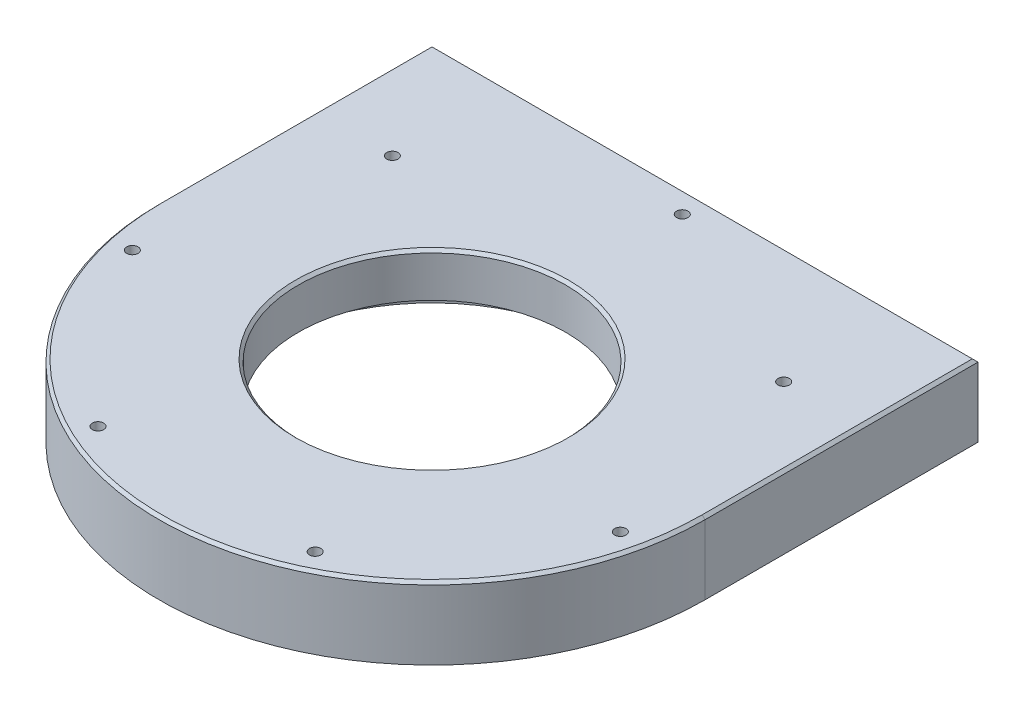
ISO-10303-21;
HEADER;
FILE_DESCRIPTION(('STEP AP214'),'2;1');
FILE_NAME('part.step','',(''),(''),'','','');
FILE_SCHEMA(('AUTOMOTIVE_DESIGN { 1 0 10303 214 1 1 1 1 }'));
ENDSEC;
DATA;
#1=APPLICATION_CONTEXT('core data for automotive mechanical design processes');
#2=APPLICATION_PROTOCOL_DEFINITION('international standard','automotive_design',2000,#1);
#3=PRODUCT_CONTEXT('',#1,'mechanical');
#4=PRODUCT('Part','Part','',(#3));
#5=PRODUCT_RELATED_PRODUCT_CATEGORY('part','',(#4));
#6=PRODUCT_DEFINITION_FORMATION('','',#4);
#7=PRODUCT_DEFINITION_CONTEXT('part definition',#1,'design');
#8=PRODUCT_DEFINITION('design','',#6,#7);
#9=PRODUCT_DEFINITION_SHAPE('','',#8);
#10=(LENGTH_UNIT() NAMED_UNIT(*) SI_UNIT(.MILLI.,.METRE.));
#11=(NAMED_UNIT(*) PLANE_ANGLE_UNIT() SI_UNIT($,.RADIAN.));
#12=(NAMED_UNIT(*) SI_UNIT($,.STERADIAN.) SOLID_ANGLE_UNIT());
#13=UNCERTAINTY_MEASURE_WITH_UNIT(LENGTH_MEASURE(1.E-05),#10,'distance_accuracy_value','');
#14=(GEOMETRIC_REPRESENTATION_CONTEXT(3) GLOBAL_UNCERTAINTY_ASSIGNED_CONTEXT((#13)) GLOBAL_UNIT_ASSIGNED_CONTEXT((#10,
#11,#12)) REPRESENTATION_CONTEXT('',''));
#15=CARTESIAN_POINT('',(0.,0.,0.));
#16=DIRECTION('',(0.,0.,1.));
#17=DIRECTION('',(1.,0.,0.));
#18=AXIS2_PLACEMENT_3D('',#15,#16,#17);
#19=CARTESIAN_POINT('',(48.,12.7,-48.));
#20=DIRECTION('',(-1.,0.,0.));
#21=DIRECTION('',(0.,0.,1.));
#22=AXIS2_PLACEMENT_3D('',#19,#20,#21);
#23=PLANE('',#22);
#24=DIRECTION('',(0.,-1.,0.));
#25=VECTOR('',#24,1.);
#26=CARTESIAN_POINT('',(48.,12.7,-48.));
#27=LINE('',#26,#25);
#28=CARTESIAN_POINT('',(48.,12.2,-48.));
#29=VERTEX_POINT('',#28);
#30=CARTESIAN_POINT('',(48.,0.,-48.));
#31=VERTEX_POINT('',#30);
#32=EDGE_CURVE('E124',#29,#31,#27,.T.);
#33=ORIENTED_EDGE('',*,*,#32,.F.);
#34=DIRECTION('',(0.,0.,1.));
#35=VECTOR('',#34,1.);
#36=CARTESIAN_POINT('',(48.,12.2,-48.));
#37=LINE('',#36,#35);
#38=CARTESIAN_POINT('',(48.,12.2,0.));
#39=VERTEX_POINT('',#38);
#40=EDGE_CURVE('E148',#29,#39,#37,.T.);
#41=ORIENTED_EDGE('',*,*,#40,.T.);
#42=DIRECTION('',(0.,-1.,0.));
#43=VECTOR('',#42,1.);
#44=CARTESIAN_POINT('',(48.,12.7,0.));
#45=LINE('',#44,#43);
#46=CARTESIAN_POINT('',(48.,0.,0.));
#47=VERTEX_POINT('',#46);
#48=EDGE_CURVE('E126',#39,#47,#45,.T.);
#49=ORIENTED_EDGE('',*,*,#48,.T.);
#50=DIRECTION('',(0.,0.,-1.));
#51=VECTOR('',#50,1.);
#52=CARTESIAN_POINT('',(48.,0.,-48.));
#53=LINE('',#52,#51);
#54=EDGE_CURVE('E113',#47,#31,#53,.T.);
#55=ORIENTED_EDGE('',*,*,#54,.T.);
#56=EDGE_LOOP('',(#33,#41,#49,#55));
#57=FACE_BOUND('',#56,.T.);
#58=ADVANCED_FACE('F41',(#57),#23,.F.);
#59=CARTESIAN_POINT('',(-48.,12.7,-48.));
#60=DIRECTION('',(0.,0.,1.));
#61=DIRECTION('',(1.,0.,0.));
#62=AXIS2_PLACEMENT_3D('',#59,#60,#61);
#63=PLANE('',#62);
#64=DIRECTION('',(0.,-1.,0.));
#65=VECTOR('',#64,1.);
#66=CARTESIAN_POINT('',(-48.,12.7,-48.));
#67=LINE('',#66,#65);
#68=CARTESIAN_POINT('',(-48.,12.2,-48.));
#69=VERTEX_POINT('',#68);
#70=CARTESIAN_POINT('',(-48.,0.,-48.));
#71=VERTEX_POINT('',#70);
#72=EDGE_CURVE('E100',#69,#71,#67,.T.);
#73=ORIENTED_EDGE('',*,*,#72,.F.);
#74=DIRECTION('',(1.,0.,0.));
#75=VECTOR('',#74,1.);
#76=CARTESIAN_POINT('',(-48.,12.2,-48.));
#77=LINE('',#76,#75);
#78=EDGE_CURVE('E11',#69,#29,#77,.T.);
#79=ORIENTED_EDGE('',*,*,#78,.T.);
#80=ORIENTED_EDGE('',*,*,#32,.T.);
#81=DIRECTION('',(-1.,0.,0.));
#82=VECTOR('',#81,1.);
#83=CARTESIAN_POINT('',(-48.,0.,-48.));
#84=LINE('',#83,#82);
#85=EDGE_CURVE('E108',#31,#71,#84,.T.);
#86=ORIENTED_EDGE('',*,*,#85,.T.);
#87=EDGE_LOOP('',(#73,#79,#80,#86));
#88=FACE_BOUND('',#87,.T.);
#89=ADVANCED_FACE('F229',(#88),#63,.F.);
#90=CARTESIAN_POINT('',(-48.,12.7,0.));
#91=DIRECTION('',(1.,0.,0.));
#92=DIRECTION('',(0.,0.,-1.));
#93=AXIS2_PLACEMENT_3D('',#90,#91,#92);
#94=PLANE('',#93);
#95=DIRECTION('',(0.,-1.,0.));
#96=VECTOR('',#95,1.);
#97=CARTESIAN_POINT('',(-48.,12.7,0.));
#98=LINE('',#97,#96);
#99=CARTESIAN_POINT('',(-48.,12.2,0.));
#100=VERTEX_POINT('',#99);
#101=CARTESIAN_POINT('',(-48.,0.,0.));
#102=VERTEX_POINT('',#101);
#103=EDGE_CURVE('E94',#100,#102,#98,.T.);
#104=ORIENTED_EDGE('',*,*,#103,.F.);
#105=DIRECTION('',(0.,0.,-1.));
#106=VECTOR('',#105,1.);
#107=CARTESIAN_POINT('',(-48.,12.2,0.));
#108=LINE('',#107,#106);
#109=EDGE_CURVE('E51',#100,#69,#108,.T.);
#110=ORIENTED_EDGE('',*,*,#109,.T.);
#111=ORIENTED_EDGE('',*,*,#72,.T.);
#112=DIRECTION('',(0.,0.,1.));
#113=VECTOR('',#112,1.);
#114=CARTESIAN_POINT('',(-48.,0.,0.));
#115=LINE('',#114,#113);
#116=EDGE_CURVE('E101',#71,#102,#115,.T.);
#117=ORIENTED_EDGE('',*,*,#116,.T.);
#118=EDGE_LOOP('',(#104,#110,#111,#117));
#119=FACE_BOUND('',#118,.T.);
#120=ADVANCED_FACE('F104',(#119),#94,.F.);
#121=CARTESIAN_POINT('',(0.,12.7,0.));
#122=DIRECTION('',(0.,-1.,0.));
#123=DIRECTION('',(0.,0.,-1.));
#124=AXIS2_PLACEMENT_3D('',#121,#122,#123);
#125=PLANE('',#124);
#126=CARTESIAN_POINT('',(0.,12.7,0.));
#127=DIRECTION('',(0.,-1.,0.));
#128=DIRECTION('',(0.,0.,-1.));
#129=AXIS2_PLACEMENT_3D('',#126,#127,#128);
#130=CIRCLE('',#129,24.);
#131=CARTESIAN_POINT('',(0.,12.7,-24.));
#132=VERTEX_POINT('',#131);
#133=EDGE_CURVE('E145',#132,#132,#130,.T.);
#134=ORIENTED_EDGE('',*,*,#133,.T.);
#135=EDGE_LOOP('',(#134));
#136=FACE_BOUND('',#135,.T.);
#137=CARTESIAN_POINT('',(0.,12.7,0.));
#138=DIRECTION('',(0.,-1.,0.));
#139=DIRECTION('',(0.,0.,-1.));
#140=AXIS2_PLACEMENT_3D('',#137,#138,#139);
#141=CIRCLE('',#140,47.5);
#142=CARTESIAN_POINT('',(-47.5,12.7,0.));
#143=VERTEX_POINT('',#142);
#144=CARTESIAN_POINT('',(47.5,12.7,0.));
#145=VERTEX_POINT('',#144);
#146=EDGE_CURVE('E140',#143,#145,#141,.F.);
#147=ORIENTED_EDGE('',*,*,#146,.T.);
#148=DIRECTION('',(0.,0.,-1.));
#149=VECTOR('',#148,1.);
#150=CARTESIAN_POINT('',(47.5,12.7,0.));
#151=LINE('',#150,#149);
#152=CARTESIAN_POINT('',(47.5,12.7,-47.5));
#153=VERTEX_POINT('',#152);
#154=EDGE_CURVE('E142',#145,#153,#151,.T.);
#155=ORIENTED_EDGE('',*,*,#154,.T.);
#156=DIRECTION('',(-1.,0.,0.));
#157=VECTOR('',#156,1.);
#158=CARTESIAN_POINT('',(0.,12.7,-47.5));
#159=LINE('',#158,#157);
#160=CARTESIAN_POINT('',(-47.5,12.7,-47.5));
#161=VERTEX_POINT('',#160);
#162=EDGE_CURVE('E136',#153,#161,#159,.T.);
#163=ORIENTED_EDGE('',*,*,#162,.T.);
#164=DIRECTION('',(0.,0.,1.));
#165=VECTOR('',#164,1.);
#166=CARTESIAN_POINT('',(-47.5,12.7,0.));
#167=LINE('',#166,#165);
#168=EDGE_CURVE('E138',#161,#143,#167,.T.);
#169=ORIENTED_EDGE('',*,*,#168,.T.);
#170=EDGE_LOOP('',(#147,#155,#163,#169));
#171=FACE_BOUND('',#170,.T.);
#172=CARTESIAN_POINT('',(34.4005852285933,12.7,-27.4335512817843));
#173=DIRECTION('',(0.,1.,0.));
#174=DIRECTION('',(0.,0.,1.));
#175=AXIS2_PLACEMENT_3D('',#172,#173,#174);
#176=CIRCLE('',#175,0.999999999999998);
#177=CARTESIAN_POINT('',(34.4005852285933,12.7,-26.4335512817843));
#178=VERTEX_POINT('',#177);
#179=EDGE_CURVE('E174',#178,#178,#176,.T.);
#180=ORIENTED_EDGE('',*,*,#179,.F.);
#181=EDGE_LOOP('',(#180));
#182=FACE_BOUND('',#181,.T.);
#183=CARTESIAN_POINT('',(0.,12.7,-44.));
#184=DIRECTION('',(0.,1.,0.));
#185=DIRECTION('',(0.,0.,1.));
#186=AXIS2_PLACEMENT_3D('',#183,#184,#185);
#187=CIRCLE('',#186,1.);
#188=CARTESIAN_POINT('',(0.,12.7,-43.));
#189=VERTEX_POINT('',#188);
#190=EDGE_CURVE('E184',#189,#189,#187,.T.);
#191=ORIENTED_EDGE('',*,*,#190,.F.);
#192=EDGE_LOOP('',(#191));
#193=FACE_BOUND('',#192,.T.);
#194=CARTESIAN_POINT('',(-34.4005852285933,12.7,-27.4335512817843));
#195=DIRECTION('',(0.,1.,0.));
#196=DIRECTION('',(0.,0.,1.));
#197=AXIS2_PLACEMENT_3D('',#194,#195,#196);
#198=CIRCLE('',#197,0.999999999999998);
#199=CARTESIAN_POINT('',(-34.4005852285933,12.7,-26.4335512817843));
#200=VERTEX_POINT('',#199);
#201=EDGE_CURVE('E132',#200,#200,#198,.T.);
#202=ORIENTED_EDGE('',*,*,#201,.F.);
#203=EDGE_LOOP('',(#202));
#204=FACE_BOUND('',#203,.T.);
#205=CARTESIAN_POINT('',(-19.0908845211726,12.7,39.6426301877064));
#206=DIRECTION('',(0.,1.,0.));
#207=DIRECTION('',(0.,0.,1.));
#208=AXIS2_PLACEMENT_3D('',#205,#206,#207);
#209=CIRCLE('',#208,1.);
#210=CARTESIAN_POINT('',(-19.0908845211726,12.7,40.6426301877064));
#211=VERTEX_POINT('',#210);
#212=EDGE_CURVE('E198',#211,#211,#209,.T.);
#213=ORIENTED_EDGE('',*,*,#212,.F.);
#214=EDGE_LOOP('',(#213));
#215=FACE_BOUND('',#214,.T.);
#216=CARTESIAN_POINT('',(42.8968281360002,12.7,9.79092109407783));
#217=DIRECTION('',(0.,1.,0.));
#218=DIRECTION('',(0.,0.,1.));
#219=AXIS2_PLACEMENT_3D('',#216,#217,#218);
#220=CIRCLE('',#219,0.999999999999998);
#221=CARTESIAN_POINT('',(42.8968281360002,12.7,10.7909210940778));
#222=VERTEX_POINT('',#221);
#223=EDGE_CURVE('E114',#222,#222,#220,.T.);
#224=ORIENTED_EDGE('',*,*,#223,.F.);
#225=EDGE_LOOP('',(#224));
#226=FACE_BOUND('',#225,.T.);
#227=CARTESIAN_POINT('',(19.0908845211726,12.7,39.6426301877064));
#228=DIRECTION('',(0.,1.,0.));
#229=DIRECTION('',(0.,0.,1.));
#230=AXIS2_PLACEMENT_3D('',#227,#228,#229);
#231=CIRCLE('',#230,1.);
#232=CARTESIAN_POINT('',(19.0908845211726,12.7,40.6426301877064));
#233=VERTEX_POINT('',#232);
#234=EDGE_CURVE('E204',#233,#233,#231,.T.);
#235=ORIENTED_EDGE('',*,*,#234,.F.);
#236=EDGE_LOOP('',(#235));
#237=FACE_BOUND('',#236,.T.);
#238=CARTESIAN_POINT('',(-42.8968281360002,12.7,9.79092109407784));
#239=DIRECTION('',(0.,1.,0.));
#240=DIRECTION('',(0.,0.,1.));
#241=AXIS2_PLACEMENT_3D('',#238,#239,#240);
#242=CIRCLE('',#241,0.999999999999998);
#243=CARTESIAN_POINT('',(-42.8968281360002,12.7,10.7909210940778));
#244=VERTEX_POINT('',#243);
#245=EDGE_CURVE('E192',#244,#244,#242,.T.);
#246=ORIENTED_EDGE('',*,*,#245,.F.);
#247=EDGE_LOOP('',(#246));
#248=FACE_BOUND('',#247,.T.);
#249=ADVANCED_FACE('F278',(#136,#171,#182,#193,#204,#215,#226,#237,#248),#125,.F.);
#250=CARTESIAN_POINT('',(0.,0.,0.));
#251=DIRECTION('',(0.,-1.,0.));
#252=DIRECTION('',(0.,0.,-1.));
#253=AXIS2_PLACEMENT_3D('',#250,#251,#252);
#254=PLANE('',#253);
#255=CARTESIAN_POINT('',(0.,0.,0.));
#256=DIRECTION('',(0.,1.,0.));
#257=DIRECTION('',(0.,0.,1.));
#258=AXIS2_PLACEMENT_3D('',#255,#256,#257);
#259=CIRCLE('',#258,30.);
#260=CARTESIAN_POINT('',(0.,0.,30.));
#261=VERTEX_POINT('',#260);
#262=EDGE_CURVE('E163',#261,#261,#259,.T.);
#263=ORIENTED_EDGE('',*,*,#262,.T.);
#264=EDGE_LOOP('',(#263));
#265=FACE_BOUND('',#264,.T.);
#266=CARTESIAN_POINT('',(34.4005852285933,0.,-27.4335512817843));
#267=DIRECTION('',(0.,1.,0.));
#268=DIRECTION('',(0.,0.,1.));
#269=AXIS2_PLACEMENT_3D('',#266,#267,#268);
#270=CIRCLE('',#269,0.999999999999998);
#271=CARTESIAN_POINT('',(34.4005852285933,0.,-26.4335512817843));
#272=VERTEX_POINT('',#271);
#273=EDGE_CURVE('E178',#272,#272,#270,.T.);
#274=ORIENTED_EDGE('',*,*,#273,.T.);
#275=EDGE_LOOP('',(#274));
#276=FACE_BOUND('',#275,.T.);
#277=CARTESIAN_POINT('',(0.,0.,-44.));
#278=DIRECTION('',(0.,1.,0.));
#279=DIRECTION('',(0.,0.,1.));
#280=AXIS2_PLACEMENT_3D('',#277,#278,#279);
#281=CIRCLE('',#280,1.);
#282=CARTESIAN_POINT('',(0.,0.,-43.));
#283=VERTEX_POINT('',#282);
#284=EDGE_CURVE('E181',#283,#283,#281,.T.);
#285=ORIENTED_EDGE('',*,*,#284,.T.);
#286=EDGE_LOOP('',(#285));
#287=FACE_BOUND('',#286,.T.);
#288=CARTESIAN_POINT('',(-34.4005852285933,0.,-27.4335512817843));
#289=DIRECTION('',(0.,1.,0.));
#290=DIRECTION('',(0.,0.,1.));
#291=AXIS2_PLACEMENT_3D('',#288,#289,#290);
#292=CIRCLE('',#291,0.999999999999998);
#293=CARTESIAN_POINT('',(-34.4005852285933,0.,-26.4335512817843));
#294=VERTEX_POINT('',#293);
#295=EDGE_CURVE('E187',#294,#294,#292,.T.);
#296=ORIENTED_EDGE('',*,*,#295,.T.);
#297=EDGE_LOOP('',(#296));
#298=FACE_BOUND('',#297,.T.);
#299=ORIENTED_EDGE('',*,*,#54,.F.);
#300=CARTESIAN_POINT('',(0.,0.,0.));
#301=DIRECTION('',(0.,1.,0.));
#302=DIRECTION('',(0.,0.,1.));
#303=AXIS2_PLACEMENT_3D('',#300,#301,#302);
#304=CIRCLE('',#303,48.);
#305=EDGE_CURVE('E98',#102,#47,#304,.T.);
#306=ORIENTED_EDGE('',*,*,#305,.F.);
#307=ORIENTED_EDGE('',*,*,#116,.F.);
#308=ORIENTED_EDGE('',*,*,#85,.F.);
#309=EDGE_LOOP('',(#299,#306,#307,#308));
#310=FACE_BOUND('',#309,.T.);
#311=CARTESIAN_POINT('',(-42.8968281360002,0.,9.79092109407784));
#312=DIRECTION('',(0.,1.,0.));
#313=DIRECTION('',(0.,0.,1.));
#314=AXIS2_PLACEMENT_3D('',#311,#312,#313);
#315=CIRCLE('',#314,0.999999999999998);
#316=CARTESIAN_POINT('',(-42.8968281360002,0.,10.7909210940778));
#317=VERTEX_POINT('',#316);
#318=EDGE_CURVE('E177',#317,#317,#315,.T.);
#319=ORIENTED_EDGE('',*,*,#318,.T.);
#320=EDGE_LOOP('',(#319));
#321=FACE_BOUND('',#320,.T.);
#322=CARTESIAN_POINT('',(-19.0908845211726,0.,39.6426301877064));
#323=DIRECTION('',(0.,1.,0.));
#324=DIRECTION('',(0.,0.,1.));
#325=AXIS2_PLACEMENT_3D('',#322,#323,#324);
#326=CIRCLE('',#325,1.);
#327=CARTESIAN_POINT('',(-19.0908845211726,0.,40.6426301877064));
#328=VERTEX_POINT('',#327);
#329=EDGE_CURVE('E195',#328,#328,#326,.T.);
#330=ORIENTED_EDGE('',*,*,#329,.T.);
#331=EDGE_LOOP('',(#330));
#332=FACE_BOUND('',#331,.T.);
#333=CARTESIAN_POINT('',(19.0908845211726,0.,39.6426301877064));
#334=DIRECTION('',(0.,1.,0.));
#335=DIRECTION('',(0.,0.,1.));
#336=AXIS2_PLACEMENT_3D('',#333,#334,#335);
#337=CIRCLE('',#336,1.);
#338=CARTESIAN_POINT('',(19.0908845211726,0.,40.6426301877064));
#339=VERTEX_POINT('',#338);
#340=EDGE_CURVE('E201',#339,#339,#337,.T.);
#341=ORIENTED_EDGE('',*,*,#340,.T.);
#342=EDGE_LOOP('',(#341));
#343=FACE_BOUND('',#342,.T.);
#344=CARTESIAN_POINT('',(42.8968281360002,0.,9.79092109407783));
#345=DIRECTION('',(0.,1.,0.));
#346=DIRECTION('',(0.,0.,1.));
#347=AXIS2_PLACEMENT_3D('',#344,#345,#346);
#348=CIRCLE('',#347,0.999999999999998);
#349=CARTESIAN_POINT('',(42.8968281360002,0.,10.7909210940778));
#350=VERTEX_POINT('',#349);
#351=EDGE_CURVE('E118',#350,#350,#348,.T.);
#352=ORIENTED_EDGE('',*,*,#351,.T.);
#353=EDGE_LOOP('',(#352));
#354=FACE_BOUND('',#353,.T.);
#355=ADVANCED_FACE('F110',(#265,#276,#287,#298,#310,#321,#332,#343,#354),#254,.T.);
#356=CARTESIAN_POINT('',(0.,12.7,0.));
#357=DIRECTION('',(0.,-1.,0.));
#358=DIRECTION('',(0.,0.,-1.));
#359=AXIS2_PLACEMENT_3D('',#356,#357,#358);
#360=CYLINDRICAL_SURFACE('',#359,48.);
#361=ORIENTED_EDGE('',*,*,#48,.F.);
#362=CARTESIAN_POINT('',(0.,12.2,0.));
#363=DIRECTION('',(0.,-1.,0.));
#364=DIRECTION('',(0.,0.,-1.));
#365=AXIS2_PLACEMENT_3D('',#362,#363,#364);
#366=CIRCLE('',#365,48.);
#367=EDGE_CURVE('E66',#39,#100,#366,.T.);
#368=ORIENTED_EDGE('',*,*,#367,.T.);
#369=ORIENTED_EDGE('',*,*,#103,.T.);
#370=ORIENTED_EDGE('',*,*,#305,.T.);
#371=EDGE_LOOP('',(#361,#368,#369,#370));
#372=FACE_BOUND('',#371,.T.);
#373=ADVANCED_FACE('F96',(#372),#360,.T.);
#374=CARTESIAN_POINT('',(0.,12.7,0.));
#375=DIRECTION('',(0.,-1.,0.));
#376=DIRECTION('',(0.,0.,-1.));
#377=AXIS2_PLACEMENT_3D('',#374,#375,#376);
#378=CYLINDRICAL_SURFACE('',#377,23.5);
#379=CARTESIAN_POINT('',(0.,12.2,0.));
#380=DIRECTION('',(0.,-1.,0.));
#381=DIRECTION('',(0.,0.,-1.));
#382=AXIS2_PLACEMENT_3D('',#379,#380,#381);
#383=CIRCLE('',#382,23.5);
#384=CARTESIAN_POINT('',(0.,12.2,-23.5));
#385=VERTEX_POINT('',#384);
#386=EDGE_CURVE('E128',#385,#385,#383,.F.);
#387=ORIENTED_EDGE('',*,*,#386,.T.);
#388=EDGE_LOOP('',(#387));
#389=FACE_BOUND('',#388,.T.);
#390=CARTESIAN_POINT('',(0.,5.,0.));
#391=DIRECTION('',(0.,1.,0.));
#392=DIRECTION('',(0.,0.,1.));
#393=AXIS2_PLACEMENT_3D('',#390,#391,#392);
#394=CIRCLE('',#393,23.5);
#395=CARTESIAN_POINT('',(0.,5.,23.5));
#396=VERTEX_POINT('',#395);
#397=EDGE_CURVE('E129',#396,#396,#394,.T.);
#398=ORIENTED_EDGE('',*,*,#397,.F.);
#399=EDGE_LOOP('',(#398));
#400=FACE_BOUND('',#399,.T.);
#401=ADVANCED_FACE('F225',(#389,#400),#378,.F.);
#402=CARTESIAN_POINT('',(42.8968281360002,12.7,9.79092109407783));
#403=DIRECTION('',(0.,-1.,0.));
#404=DIRECTION('',(0.,0.,-1.));
#405=AXIS2_PLACEMENT_3D('',#402,#403,#404);
#406=CYLINDRICAL_SURFACE('',#405,0.999999999999998);
#407=ORIENTED_EDGE('',*,*,#223,.T.);
#408=EDGE_LOOP('',(#407));
#409=FACE_BOUND('',#408,.T.);
#410=ORIENTED_EDGE('',*,*,#351,.F.);
#411=EDGE_LOOP('',(#410));
#412=FACE_BOUND('',#411,.T.);
#413=ADVANCED_FACE('F215',(#409,#412),#406,.F.);
#414=CARTESIAN_POINT('',(19.0908845211726,12.7,39.6426301877064));
#415=DIRECTION('',(0.,-1.,0.));
#416=DIRECTION('',(0.,0.,-1.));
#417=AXIS2_PLACEMENT_3D('',#414,#415,#416);
#418=CYLINDRICAL_SURFACE('',#417,1.);
#419=ORIENTED_EDGE('',*,*,#234,.T.);
#420=EDGE_LOOP('',(#419));
#421=FACE_BOUND('',#420,.T.);
#422=ORIENTED_EDGE('',*,*,#340,.F.);
#423=EDGE_LOOP('',(#422));
#424=FACE_BOUND('',#423,.T.);
#425=ADVANCED_FACE('F212',(#421,#424),#418,.F.);
#426=CARTESIAN_POINT('',(-19.0908845211726,12.7,39.6426301877064));
#427=DIRECTION('',(0.,-1.,0.));
#428=DIRECTION('',(0.,0.,-1.));
#429=AXIS2_PLACEMENT_3D('',#426,#427,#428);
#430=CYLINDRICAL_SURFACE('',#429,1.);
#431=ORIENTED_EDGE('',*,*,#212,.T.);
#432=EDGE_LOOP('',(#431));
#433=FACE_BOUND('',#432,.T.);
#434=ORIENTED_EDGE('',*,*,#329,.F.);
#435=EDGE_LOOP('',(#434));
#436=FACE_BOUND('',#435,.T.);
#437=ADVANCED_FACE('F214',(#433,#436),#430,.F.);
#438=CARTESIAN_POINT('',(-42.8968281360002,12.7,9.79092109407784));
#439=DIRECTION('',(0.,-1.,0.));
#440=DIRECTION('',(0.,0.,-1.));
#441=AXIS2_PLACEMENT_3D('',#438,#439,#440);
#442=CYLINDRICAL_SURFACE('',#441,0.999999999999998);
#443=ORIENTED_EDGE('',*,*,#245,.T.);
#444=EDGE_LOOP('',(#443));
#445=FACE_BOUND('',#444,.T.);
#446=ORIENTED_EDGE('',*,*,#318,.F.);
#447=EDGE_LOOP('',(#446));
#448=FACE_BOUND('',#447,.T.);
#449=ADVANCED_FACE('F222',(#445,#448),#442,.F.);
#450=CARTESIAN_POINT('',(-34.4005852285933,12.7,-27.4335512817843));
#451=DIRECTION('',(0.,-1.,0.));
#452=DIRECTION('',(0.,0.,-1.));
#453=AXIS2_PLACEMENT_3D('',#450,#451,#452);
#454=CYLINDRICAL_SURFACE('',#453,0.999999999999998);
#455=ORIENTED_EDGE('',*,*,#201,.T.);
#456=EDGE_LOOP('',(#455));
#457=FACE_BOUND('',#456,.T.);
#458=ORIENTED_EDGE('',*,*,#295,.F.);
#459=EDGE_LOOP('',(#458));
#460=FACE_BOUND('',#459,.T.);
#461=ADVANCED_FACE('F299',(#457,#460),#454,.F.);
#462=CARTESIAN_POINT('',(0.,12.7,-44.));
#463=DIRECTION('',(0.,-1.,0.));
#464=DIRECTION('',(0.,0.,-1.));
#465=AXIS2_PLACEMENT_3D('',#462,#463,#464);
#466=CYLINDRICAL_SURFACE('',#465,1.);
#467=ORIENTED_EDGE('',*,*,#190,.T.);
#468=EDGE_LOOP('',(#467));
#469=FACE_BOUND('',#468,.T.);
#470=ORIENTED_EDGE('',*,*,#284,.F.);
#471=EDGE_LOOP('',(#470));
#472=FACE_BOUND('',#471,.T.);
#473=ADVANCED_FACE('F392',(#469,#472),#466,.F.);
#474=CARTESIAN_POINT('',(34.4005852285933,12.7,-27.4335512817843));
#475=DIRECTION('',(0.,-1.,0.));
#476=DIRECTION('',(0.,0.,-1.));
#477=AXIS2_PLACEMENT_3D('',#474,#475,#476);
#478=CYLINDRICAL_SURFACE('',#477,0.999999999999998);
#479=ORIENTED_EDGE('',*,*,#179,.T.);
#480=EDGE_LOOP('',(#479));
#481=FACE_BOUND('',#480,.T.);
#482=ORIENTED_EDGE('',*,*,#273,.F.);
#483=EDGE_LOOP('',(#482));
#484=FACE_BOUND('',#483,.T.);
#485=ADVANCED_FACE('F383',(#481,#484),#478,.F.);
#486=CARTESIAN_POINT('',(0.,5.,0.));
#487=DIRECTION('',(0.,-1.,0.));
#488=DIRECTION('',(0.,0.,-1.));
#489=AXIS2_PLACEMENT_3D('',#486,#487,#488);
#490=CYLINDRICAL_SURFACE('',#489,30.);
#491=CARTESIAN_POINT('',(0.,5.,0.));
#492=DIRECTION('',(0.,1.,0.));
#493=DIRECTION('',(0.,0.,1.));
#494=AXIS2_PLACEMENT_3D('',#491,#492,#493);
#495=CIRCLE('',#494,30.);
#496=CARTESIAN_POINT('',(0.,5.,30.));
#497=VERTEX_POINT('',#496);
#498=EDGE_CURVE('E133',#497,#497,#495,.T.);
#499=ORIENTED_EDGE('',*,*,#498,.T.);
#500=EDGE_LOOP('',(#499));
#501=FACE_BOUND('',#500,.T.);
#502=ORIENTED_EDGE('',*,*,#262,.F.);
#503=EDGE_LOOP('',(#502));
#504=FACE_BOUND('',#503,.T.);
#505=ADVANCED_FACE('F374',(#501,#504),#490,.F.);
#506=CARTESIAN_POINT('',(0.,5.,0.));
#507=DIRECTION('',(0.,1.,0.));
#508=DIRECTION('',(0.,0.,1.));
#509=AXIS2_PLACEMENT_3D('',#506,#507,#508);
#510=PLANE('',#509);
#511=ORIENTED_EDGE('',*,*,#397,.T.);
#512=EDGE_LOOP('',(#511));
#513=FACE_BOUND('',#512,.T.);
#514=ORIENTED_EDGE('',*,*,#498,.F.);
#515=EDGE_LOOP('',(#514));
#516=FACE_BOUND('',#515,.T.);
#517=ADVANCED_FACE('F247',(#513,#516),#510,.F.);
#518=CARTESIAN_POINT('',(0.,12.2,0.));
#519=DIRECTION('',(0.,1.,0.));
#520=DIRECTION('',(0.,0.,1.));
#521=AXIS2_PLACEMENT_3D('',#518,#519,#520);
#522=CONICAL_SURFACE('',#521,23.5,0.785398163397448);
#523=ORIENTED_EDGE('',*,*,#133,.F.);
#524=EDGE_LOOP('',(#523));
#525=FACE_BOUND('',#524,.T.);
#526=ORIENTED_EDGE('',*,*,#386,.F.);
#527=EDGE_LOOP('',(#526));
#528=FACE_BOUND('',#527,.T.);
#529=ADVANCED_FACE('F242',(#525,#528),#522,.F.);
#530=CARTESIAN_POINT('',(-47.5,12.7,0.));
#531=DIRECTION('',(0.707106781186547,-0.707106781186547,0.));
#532=DIRECTION('',(0.,0.,1.));
#533=AXIS2_PLACEMENT_3D('',#530,#531,#532);
#534=PLANE('',#533);
#535=DIRECTION('',(0.577350269189626,0.577350269189626,0.577350269189626));
#536=VECTOR('',#535,1.);
#537=CARTESIAN_POINT('',(-31.6666666666667,28.5333333333333,-31.6666666666667));
#538=LINE('',#537,#536);
#539=EDGE_CURVE('E156',#69,#161,#538,.T.);
#540=ORIENTED_EDGE('',*,*,#539,.F.);
#541=ORIENTED_EDGE('',*,*,#109,.F.);
#542=DIRECTION('',(-0.707106781186547,-0.707106781186547,0.));
#543=VECTOR('',#542,1.);
#544=CARTESIAN_POINT('',(-47.5,12.7,0.));
#545=LINE('',#544,#543);
#546=EDGE_CURVE('E46',#143,#100,#545,.T.);
#547=ORIENTED_EDGE('',*,*,#546,.F.);
#548=ORIENTED_EDGE('',*,*,#168,.F.);
#549=EDGE_LOOP('',(#540,#541,#547,#548));
#550=FACE_BOUND('',#549,.T.);
#551=ADVANCED_FACE('F44',(#550),#534,.F.);
#552=CARTESIAN_POINT('',(0.,12.7,0.));
#553=DIRECTION('',(0.,-1.,0.));
#554=DIRECTION('',(0.,0.,-1.));
#555=AXIS2_PLACEMENT_3D('',#552,#553,#554);
#556=CONICAL_SURFACE('',#555,47.5,0.785398163397448);
#557=ORIENTED_EDGE('',*,*,#546,.T.);
#558=ORIENTED_EDGE('',*,*,#367,.F.);
#559=DIRECTION('',(0.707106781186547,-0.707106781186547,0.));
#560=VECTOR('',#559,1.);
#561=CARTESIAN_POINT('',(47.5,12.7,0.));
#562=LINE('',#561,#560);
#563=EDGE_CURVE('E155',#145,#39,#562,.T.);
#564=ORIENTED_EDGE('',*,*,#563,.F.);
#565=ORIENTED_EDGE('',*,*,#146,.F.);
#566=EDGE_LOOP('',(#557,#558,#564,#565));
#567=FACE_BOUND('',#566,.T.);
#568=ADVANCED_FACE('F262',(#567),#556,.T.);
#569=CARTESIAN_POINT('',(0.,12.7,-47.5));
#570=DIRECTION('',(0.,-0.707106781186547,0.707106781186547));
#571=DIRECTION('',(-1.,0.,0.));
#572=AXIS2_PLACEMENT_3D('',#569,#570,#571);
#573=PLANE('',#572);
#574=ORIENTED_EDGE('',*,*,#539,.T.);
#575=ORIENTED_EDGE('',*,*,#162,.F.);
#576=DIRECTION('',(0.577350269189626,-0.577350269189626,-0.577350269189626));
#577=VECTOR('',#576,1.);
#578=CARTESIAN_POINT('',(31.6666666666667,28.5333333333333,-31.6666666666667));
#579=LINE('',#578,#577);
#580=EDGE_CURVE('E153',#29,#153,#579,.F.);
#581=ORIENTED_EDGE('',*,*,#580,.F.);
#582=ORIENTED_EDGE('',*,*,#78,.F.);
#583=EDGE_LOOP('',(#574,#575,#581,#582));
#584=FACE_BOUND('',#583,.T.);
#585=ADVANCED_FACE('F256',(#584),#573,.F.);
#586=CARTESIAN_POINT('',(47.5,12.7,0.));
#587=DIRECTION('',(-0.707106781186547,-0.707106781186547,0.));
#588=DIRECTION('',(0.,0.,-1.));
#589=AXIS2_PLACEMENT_3D('',#586,#587,#588);
#590=PLANE('',#589);
#591=ORIENTED_EDGE('',*,*,#563,.T.);
#592=ORIENTED_EDGE('',*,*,#40,.F.);
#593=ORIENTED_EDGE('',*,*,#580,.T.);
#594=ORIENTED_EDGE('',*,*,#154,.F.);
#595=EDGE_LOOP('',(#591,#592,#593,#594));
#596=FACE_BOUND('',#595,.T.);
#597=ADVANCED_FACE('F250',(#596),#590,.F.);
#598=CLOSED_SHELL('',(#58,#89,#120,#249,#355,#373,#401,#413,#425,#437,#449,#461,#473,#485,#505,
#517,#529,#551,#568,#585,#597));
#599=MANIFOLD_SOLID_BREP('B2',#598);
#600=ADVANCED_BREP_SHAPE_REPRESENTATION('',(#18,#599),#14);
#601=SHAPE_DEFINITION_REPRESENTATION(#9,#600);
ENDSEC;
END-ISO-10303-21;
